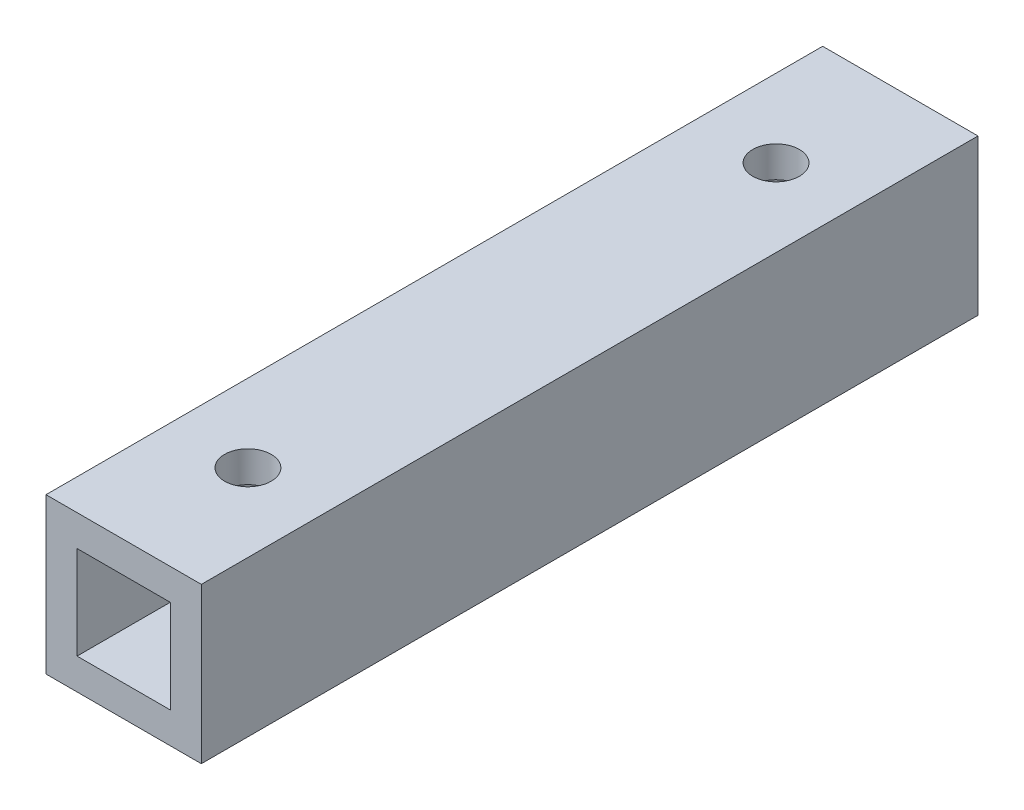
ISO-10303-21;
HEADER;
FILE_DESCRIPTION(('STEP AP214'),'2;1');
FILE_NAME('part.step','',(''),(''),'','','');
FILE_SCHEMA(('AUTOMOTIVE_DESIGN { 1 0 10303 214 1 1 1 1 }'));
ENDSEC;
DATA;
#1=APPLICATION_CONTEXT('core data for automotive mechanical design processes');
#2=APPLICATION_PROTOCOL_DEFINITION('international standard','automotive_design',2000,#1);
#3=PRODUCT_CONTEXT('',#1,'mechanical');
#4=PRODUCT('Part','Part','',(#3));
#5=PRODUCT_RELATED_PRODUCT_CATEGORY('part','',(#4));
#6=PRODUCT_DEFINITION_FORMATION('','',#4);
#7=PRODUCT_DEFINITION_CONTEXT('part definition',#1,'design');
#8=PRODUCT_DEFINITION('design','',#6,#7);
#9=PRODUCT_DEFINITION_SHAPE('','',#8);
#10=(LENGTH_UNIT() NAMED_UNIT(*) SI_UNIT(.MILLI.,.METRE.));
#11=(NAMED_UNIT(*) PLANE_ANGLE_UNIT() SI_UNIT($,.RADIAN.));
#12=(NAMED_UNIT(*) SI_UNIT($,.STERADIAN.) SOLID_ANGLE_UNIT());
#13=UNCERTAINTY_MEASURE_WITH_UNIT(LENGTH_MEASURE(1.E-05),#10,'distance_accuracy_value','');
#14=(GEOMETRIC_REPRESENTATION_CONTEXT(3) GLOBAL_UNCERTAINTY_ASSIGNED_CONTEXT((#13)) GLOBAL_UNIT_ASSIGNED_CONTEXT((#10,
#11,#12)) REPRESENTATION_CONTEXT('',''));
#15=CARTESIAN_POINT('',(0.,0.,0.));
#16=DIRECTION('',(0.,0.,1.));
#17=DIRECTION('',(1.,0.,0.));
#18=AXIS2_PLACEMENT_3D('',#15,#16,#17);
#19=CARTESIAN_POINT('',(0.,-5.,-17.));
#20=DIRECTION('',(0.,1.,0.));
#21=DIRECTION('',(0.,0.,1.));
#22=AXIS2_PLACEMENT_3D('',#19,#20,#21);
#23=CYLINDRICAL_SURFACE('',#22,1.5);
#24=CARTESIAN_POINT('',(0.,-3.,-17.));
#25=DIRECTION('',(0.,-1.,0.));
#26=DIRECTION('',(0.,0.,-1.));
#27=AXIS2_PLACEMENT_3D('',#24,#25,#26);
#28=CIRCLE('',#27,1.5);
#29=CARTESIAN_POINT('',(0.,-3.,-18.5));
#30=VERTEX_POINT('',#29);
#31=EDGE_CURVE('E143',#30,#30,#28,.F.);
#32=ORIENTED_EDGE('',*,*,#31,.T.);
#33=EDGE_LOOP('',(#32));
#34=FACE_BOUND('',#33,.T.);
#35=CARTESIAN_POINT('',(0.,-5.,-17.));
#36=DIRECTION('',(0.,1.,0.));
#37=DIRECTION('',(0.,0.,1.));
#38=AXIS2_PLACEMENT_3D('',#35,#36,#37);
#39=CIRCLE('',#38,1.5);
#40=CARTESIAN_POINT('',(0.,-5.,-15.5));
#41=VERTEX_POINT('',#40);
#42=EDGE_CURVE('E153',#41,#41,#39,.T.);
#43=ORIENTED_EDGE('',*,*,#42,.F.);
#44=EDGE_LOOP('',(#43));
#45=FACE_BOUND('',#44,.T.);
#46=ADVANCED_FACE('F35',(#34,#45),#23,.F.);
#47=CARTESIAN_POINT('',(0.,-5.,17.));
#48=DIRECTION('',(0.,1.,0.));
#49=DIRECTION('',(0.,0.,1.));
#50=AXIS2_PLACEMENT_3D('',#47,#48,#49);
#51=CYLINDRICAL_SURFACE('',#50,1.5);
#52=CARTESIAN_POINT('',(0.,-3.,17.));
#53=DIRECTION('',(0.,-1.,0.));
#54=DIRECTION('',(0.,0.,-1.));
#55=AXIS2_PLACEMENT_3D('',#52,#53,#54);
#56=CIRCLE('',#55,1.5);
#57=CARTESIAN_POINT('',(0.,-3.,15.5));
#58=VERTEX_POINT('',#57);
#59=EDGE_CURVE('E39',#58,#58,#56,.T.);
#60=ORIENTED_EDGE('',*,*,#59,.F.);
#61=EDGE_LOOP('',(#60));
#62=FACE_BOUND('',#61,.T.);
#63=CARTESIAN_POINT('',(0.,-5.,17.));
#64=DIRECTION('',(0.,-1.,0.));
#65=DIRECTION('',(0.,0.,-1.));
#66=AXIS2_PLACEMENT_3D('',#63,#64,#65);
#67=CIRCLE('',#66,1.5);
#68=CARTESIAN_POINT('',(0.,-5.,15.5));
#69=VERTEX_POINT('',#68);
#70=EDGE_CURVE('E147',#69,#69,#67,.T.);
#71=ORIENTED_EDGE('',*,*,#70,.T.);
#72=EDGE_LOOP('',(#71));
#73=FACE_BOUND('',#72,.T.);
#74=ADVANCED_FACE('F193',(#62,#73),#51,.F.);
#75=CARTESIAN_POINT('',(5.,5.,25.));
#76=DIRECTION('',(-1.,0.,0.));
#77=DIRECTION('',(0.,-1.,0.));
#78=AXIS2_PLACEMENT_3D('',#75,#76,#77);
#79=PLANE('',#78);
#80=DIRECTION('',(0.,1.,0.));
#81=VECTOR('',#80,1.);
#82=CARTESIAN_POINT('',(5.,5.,-25.));
#83=LINE('',#82,#81);
#84=CARTESIAN_POINT('',(5.,-5.,-25.));
#85=VERTEX_POINT('',#84);
#86=CARTESIAN_POINT('',(5.,5.,-25.));
#87=VERTEX_POINT('',#86);
#88=EDGE_CURVE('E156',#85,#87,#83,.T.);
#89=ORIENTED_EDGE('',*,*,#88,.T.);
#90=DIRECTION('',(0.,0.,-1.));
#91=VECTOR('',#90,1.);
#92=CARTESIAN_POINT('',(5.,5.,25.));
#93=LINE('',#92,#91);
#94=CARTESIAN_POINT('',(5.,5.,25.));
#95=VERTEX_POINT('',#94);
#96=EDGE_CURVE('E11',#95,#87,#93,.T.);
#97=ORIENTED_EDGE('',*,*,#96,.F.);
#98=DIRECTION('',(0.,1.,0.));
#99=VECTOR('',#98,1.);
#100=CARTESIAN_POINT('',(5.,5.,25.));
#101=LINE('',#100,#99);
#102=CARTESIAN_POINT('',(5.,-5.,25.));
#103=VERTEX_POINT('',#102);
#104=EDGE_CURVE('E159',#103,#95,#101,.T.);
#105=ORIENTED_EDGE('',*,*,#104,.F.);
#106=DIRECTION('',(0.,0.,-1.));
#107=VECTOR('',#106,1.);
#108=CARTESIAN_POINT('',(5.,-5.,25.));
#109=LINE('',#108,#107);
#110=EDGE_CURVE('E169',#103,#85,#109,.T.);
#111=ORIENTED_EDGE('',*,*,#110,.T.);
#112=EDGE_LOOP('',(#89,#97,#105,#111));
#113=FACE_BOUND('',#112,.T.);
#114=ADVANCED_FACE('F37',(#113),#79,.F.);
#115=CARTESIAN_POINT('',(-5.,5.,25.));
#116=DIRECTION('',(0.,-1.,0.));
#117=DIRECTION('',(0.,0.,-1.));
#118=AXIS2_PLACEMENT_3D('',#115,#116,#117);
#119=PLANE('',#118);
#120=CARTESIAN_POINT('',(0.,5.,17.));
#121=DIRECTION('',(0.,-1.,0.));
#122=DIRECTION('',(0.,0.,-1.));
#123=AXIS2_PLACEMENT_3D('',#120,#121,#122);
#124=CIRCLE('',#123,1.5);
#125=CARTESIAN_POINT('',(0.,5.,15.5));
#126=VERTEX_POINT('',#125);
#127=EDGE_CURVE('E146',#126,#126,#124,.T.);
#128=ORIENTED_EDGE('',*,*,#127,.T.);
#129=EDGE_LOOP('',(#128));
#130=FACE_BOUND('',#129,.T.);
#131=CARTESIAN_POINT('',(0.,5.,-17.));
#132=DIRECTION('',(0.,1.,0.));
#133=DIRECTION('',(0.,0.,1.));
#134=AXIS2_PLACEMENT_3D('',#131,#132,#133);
#135=CIRCLE('',#134,1.5);
#136=CARTESIAN_POINT('',(0.,5.,-15.5));
#137=VERTEX_POINT('',#136);
#138=EDGE_CURVE('E150',#137,#137,#135,.T.);
#139=ORIENTED_EDGE('',*,*,#138,.F.);
#140=EDGE_LOOP('',(#139));
#141=FACE_BOUND('',#140,.T.);
#142=DIRECTION('',(-1.,0.,0.));
#143=VECTOR('',#142,1.);
#144=CARTESIAN_POINT('',(-5.,5.,-25.));
#145=LINE('',#144,#143);
#146=CARTESIAN_POINT('',(-5.,5.,-25.));
#147=VERTEX_POINT('',#146);
#148=EDGE_CURVE('E172',#87,#147,#145,.T.);
#149=ORIENTED_EDGE('',*,*,#148,.T.);
#150=DIRECTION('',(0.,0.,-1.));
#151=VECTOR('',#150,1.);
#152=CARTESIAN_POINT('',(-5.,5.,25.));
#153=LINE('',#152,#151);
#154=CARTESIAN_POINT('',(-5.,5.,25.));
#155=VERTEX_POINT('',#154);
#156=EDGE_CURVE('E44',#155,#147,#153,.T.);
#157=ORIENTED_EDGE('',*,*,#156,.F.);
#158=DIRECTION('',(-1.,0.,0.));
#159=VECTOR('',#158,1.);
#160=CARTESIAN_POINT('',(-5.,5.,25.));
#161=LINE('',#160,#159);
#162=EDGE_CURVE('E162',#95,#155,#161,.T.);
#163=ORIENTED_EDGE('',*,*,#162,.F.);
#164=ORIENTED_EDGE('',*,*,#96,.T.);
#165=EDGE_LOOP('',(#149,#157,#163,#164));
#166=FACE_BOUND('',#165,.T.);
#167=ADVANCED_FACE('F196',(#130,#141,#166),#119,.F.);
#168=CARTESIAN_POINT('',(-5.,5.,25.));
#169=DIRECTION('',(1.,0.,0.));
#170=DIRECTION('',(0.,1.,0.));
#171=AXIS2_PLACEMENT_3D('',#168,#169,#170);
#172=PLANE('',#171);
#173=DIRECTION('',(0.,-1.,0.));
#174=VECTOR('',#173,1.);
#175=CARTESIAN_POINT('',(-5.,5.,-25.));
#176=LINE('',#175,#174);
#177=CARTESIAN_POINT('',(-5.,-5.,-25.));
#178=VERTEX_POINT('',#177);
#179=EDGE_CURVE('E174',#147,#178,#176,.T.);
#180=ORIENTED_EDGE('',*,*,#179,.T.);
#181=DIRECTION('',(0.,0.,-1.));
#182=VECTOR('',#181,1.);
#183=CARTESIAN_POINT('',(-5.,-5.,25.));
#184=LINE('',#183,#182);
#185=CARTESIAN_POINT('',(-5.,-5.,25.));
#186=VERTEX_POINT('',#185);
#187=EDGE_CURVE('E179',#186,#178,#184,.T.);
#188=ORIENTED_EDGE('',*,*,#187,.F.);
#189=DIRECTION('',(0.,-1.,0.));
#190=VECTOR('',#189,1.);
#191=CARTESIAN_POINT('',(-5.,5.,25.));
#192=LINE('',#191,#190);
#193=EDGE_CURVE('E165',#155,#186,#192,.T.);
#194=ORIENTED_EDGE('',*,*,#193,.F.);
#195=ORIENTED_EDGE('',*,*,#156,.T.);
#196=EDGE_LOOP('',(#180,#188,#194,#195));
#197=FACE_BOUND('',#196,.T.);
#198=ADVANCED_FACE('F199',(#197),#172,.F.);
#199=CARTESIAN_POINT('',(-5.,-5.,25.));
#200=DIRECTION('',(0.,1.,0.));
#201=DIRECTION('',(0.,0.,1.));
#202=AXIS2_PLACEMENT_3D('',#199,#200,#201);
#203=PLANE('',#202);
#204=ORIENTED_EDGE('',*,*,#70,.F.);
#205=EDGE_LOOP('',(#204));
#206=FACE_BOUND('',#205,.T.);
#207=ORIENTED_EDGE('',*,*,#42,.T.);
#208=EDGE_LOOP('',(#207));
#209=FACE_BOUND('',#208,.T.);
#210=DIRECTION('',(1.,0.,0.));
#211=VECTOR('',#210,1.);
#212=CARTESIAN_POINT('',(-5.,-5.,-25.));
#213=LINE('',#212,#211);
#214=EDGE_CURVE('E163',#178,#85,#213,.T.);
#215=ORIENTED_EDGE('',*,*,#214,.T.);
#216=ORIENTED_EDGE('',*,*,#110,.F.);
#217=DIRECTION('',(1.,0.,0.));
#218=VECTOR('',#217,1.);
#219=CARTESIAN_POINT('',(-5.,-5.,25.));
#220=LINE('',#219,#218);
#221=EDGE_CURVE('E167',#186,#103,#220,.T.);
#222=ORIENTED_EDGE('',*,*,#221,.F.);
#223=ORIENTED_EDGE('',*,*,#187,.T.);
#224=EDGE_LOOP('',(#215,#216,#222,#223));
#225=FACE_BOUND('',#224,.T.);
#226=ADVANCED_FACE('F212',(#206,#209,#225),#203,.F.);
#227=CARTESIAN_POINT('',(0.,0.,25.));
#228=DIRECTION('',(0.,0.,1.));
#229=DIRECTION('',(1.,0.,0.));
#230=AXIS2_PLACEMENT_3D('',#227,#228,#229);
#231=PLANE('',#230);
#232=DIRECTION('',(0.,1.,0.));
#233=VECTOR('',#232,1.);
#234=CARTESIAN_POINT('',(3.,3.,25.));
#235=LINE('',#234,#233);
#236=CARTESIAN_POINT('',(3.,-3.,25.));
#237=VERTEX_POINT('',#236);
#238=CARTESIAN_POINT('',(3.,3.,25.));
#239=VERTEX_POINT('',#238);
#240=EDGE_CURVE('E52',#237,#239,#235,.T.);
#241=ORIENTED_EDGE('',*,*,#240,.F.);
#242=DIRECTION('',(1.,0.,0.));
#243=VECTOR('',#242,1.);
#244=CARTESIAN_POINT('',(-3.,-3.,25.));
#245=LINE('',#244,#243);
#246=CARTESIAN_POINT('',(-3.,-3.,25.));
#247=VERTEX_POINT('',#246);
#248=EDGE_CURVE('E121',#247,#237,#245,.T.);
#249=ORIENTED_EDGE('',*,*,#248,.F.);
#250=DIRECTION('',(0.,-1.,0.));
#251=VECTOR('',#250,1.);
#252=CARTESIAN_POINT('',(-3.,3.,25.));
#253=LINE('',#252,#251);
#254=CARTESIAN_POINT('',(-3.,3.,25.));
#255=VERTEX_POINT('',#254);
#256=EDGE_CURVE('E124',#255,#247,#253,.T.);
#257=ORIENTED_EDGE('',*,*,#256,.F.);
#258=DIRECTION('',(-1.,0.,0.));
#259=VECTOR('',#258,1.);
#260=CARTESIAN_POINT('',(-3.,3.,25.));
#261=LINE('',#260,#259);
#262=EDGE_CURVE('E130',#239,#255,#261,.T.);
#263=ORIENTED_EDGE('',*,*,#262,.F.);
#264=EDGE_LOOP('',(#241,#249,#257,#263));
#265=FACE_BOUND('',#264,.T.);
#266=ORIENTED_EDGE('',*,*,#104,.T.);
#267=ORIENTED_EDGE('',*,*,#162,.T.);
#268=ORIENTED_EDGE('',*,*,#193,.T.);
#269=ORIENTED_EDGE('',*,*,#221,.T.);
#270=EDGE_LOOP('',(#266,#267,#268,#269));
#271=FACE_BOUND('',#270,.T.);
#272=ADVANCED_FACE('F217',(#265,#271),#231,.T.);
#273=CARTESIAN_POINT('',(0.,0.,-25.));
#274=DIRECTION('',(0.,0.,1.));
#275=DIRECTION('',(1.,0.,0.));
#276=AXIS2_PLACEMENT_3D('',#273,#274,#275);
#277=PLANE('',#276);
#278=DIRECTION('',(1.,0.,0.));
#279=VECTOR('',#278,1.);
#280=CARTESIAN_POINT('',(-3.,-3.,-25.));
#281=LINE('',#280,#279);
#282=CARTESIAN_POINT('',(-3.,-3.,-25.));
#283=VERTEX_POINT('',#282);
#284=CARTESIAN_POINT('',(3.,-3.,-25.));
#285=VERTEX_POINT('',#284);
#286=EDGE_CURVE('E110',#283,#285,#281,.T.);
#287=ORIENTED_EDGE('',*,*,#286,.T.);
#288=DIRECTION('',(0.,1.,0.));
#289=VECTOR('',#288,1.);
#290=CARTESIAN_POINT('',(3.,3.,-25.));
#291=LINE('',#290,#289);
#292=CARTESIAN_POINT('',(3.,3.,-25.));
#293=VERTEX_POINT('',#292);
#294=EDGE_CURVE('E104',#285,#293,#291,.T.);
#295=ORIENTED_EDGE('',*,*,#294,.T.);
#296=DIRECTION('',(-1.,0.,0.));
#297=VECTOR('',#296,1.);
#298=CARTESIAN_POINT('',(-3.,3.,-25.));
#299=LINE('',#298,#297);
#300=CARTESIAN_POINT('',(-3.,3.,-25.));
#301=VERTEX_POINT('',#300);
#302=EDGE_CURVE('E113',#293,#301,#299,.T.);
#303=ORIENTED_EDGE('',*,*,#302,.T.);
#304=DIRECTION('',(0.,-1.,0.));
#305=VECTOR('',#304,1.);
#306=CARTESIAN_POINT('',(-3.,3.,-25.));
#307=LINE('',#306,#305);
#308=EDGE_CURVE('E60',#301,#283,#307,.T.);
#309=ORIENTED_EDGE('',*,*,#308,.T.);
#310=EDGE_LOOP('',(#287,#295,#303,#309));
#311=FACE_BOUND('',#310,.T.);
#312=ORIENTED_EDGE('',*,*,#88,.F.);
#313=ORIENTED_EDGE('',*,*,#214,.F.);
#314=ORIENTED_EDGE('',*,*,#179,.F.);
#315=ORIENTED_EDGE('',*,*,#148,.F.);
#316=EDGE_LOOP('',(#312,#313,#314,#315));
#317=FACE_BOUND('',#316,.T.);
#318=ADVANCED_FACE('F118',(#311,#317),#277,.F.);
#319=CARTESIAN_POINT('',(0.,3.,-17.));
#320=DIRECTION('',(0.,1.,0.));
#321=DIRECTION('',(0.,0.,1.));
#322=AXIS2_PLACEMENT_3D('',#319,#320,#321);
#323=CIRCLE('',#322,1.5);
#324=CARTESIAN_POINT('',(0.,3.,-15.5));
#325=VERTEX_POINT('',#324);
#326=EDGE_CURVE('E140',#325,#325,#323,.F.);
#327=ORIENTED_EDGE('',*,*,#326,.T.);
#328=EDGE_LOOP('',(#327));
#329=FACE_BOUND('',#328,.T.);
#330=ORIENTED_EDGE('',*,*,#138,.T.);
#331=EDGE_LOOP('',(#330));
#332=FACE_BOUND('',#331,.T.);
#333=ADVANCED_FACE('F191',(#329,#332),#23,.F.);
#334=CARTESIAN_POINT('',(0.,3.,17.));
#335=DIRECTION('',(0.,1.,0.));
#336=DIRECTION('',(0.,0.,1.));
#337=AXIS2_PLACEMENT_3D('',#334,#335,#336);
#338=CIRCLE('',#337,1.5);
#339=CARTESIAN_POINT('',(0.,3.,18.5));
#340=VERTEX_POINT('',#339);
#341=EDGE_CURVE('E136',#340,#340,#338,.T.);
#342=ORIENTED_EDGE('',*,*,#341,.F.);
#343=EDGE_LOOP('',(#342));
#344=FACE_BOUND('',#343,.T.);
#345=ORIENTED_EDGE('',*,*,#127,.F.);
#346=EDGE_LOOP('',(#345));
#347=FACE_BOUND('',#346,.T.);
#348=ADVANCED_FACE('F187',(#344,#347),#51,.F.);
#349=CARTESIAN_POINT('',(-3.,-3.,-25.));
#350=DIRECTION('',(0.,-1.,0.));
#351=DIRECTION('',(0.,0.,-1.));
#352=AXIS2_PLACEMENT_3D('',#349,#350,#351);
#353=PLANE('',#352);
#354=ORIENTED_EDGE('',*,*,#248,.T.);
#355=DIRECTION('',(0.,0.,1.));
#356=VECTOR('',#355,1.);
#357=CARTESIAN_POINT('',(3.,-3.,-25.));
#358=LINE('',#357,#356);
#359=EDGE_CURVE('E134',#285,#237,#358,.T.);
#360=ORIENTED_EDGE('',*,*,#359,.F.);
#361=ORIENTED_EDGE('',*,*,#286,.F.);
#362=DIRECTION('',(0.,0.,1.));
#363=VECTOR('',#362,1.);
#364=CARTESIAN_POINT('',(-3.,-3.,-25.));
#365=LINE('',#364,#363);
#366=EDGE_CURVE('E137',#283,#247,#365,.T.);
#367=ORIENTED_EDGE('',*,*,#366,.T.);
#368=EDGE_LOOP('',(#354,#360,#361,#367));
#369=FACE_BOUND('',#368,.T.);
#370=ORIENTED_EDGE('',*,*,#59,.T.);
#371=EDGE_LOOP('',(#370));
#372=FACE_BOUND('',#371,.T.);
#373=ORIENTED_EDGE('',*,*,#31,.F.);
#374=EDGE_LOOP('',(#373));
#375=FACE_BOUND('',#374,.T.);
#376=ADVANCED_FACE('F190',(#369,#372,#375),#353,.F.);
#377=CARTESIAN_POINT('',(-3.,3.,-25.));
#378=DIRECTION('',(0.,1.,0.));
#379=DIRECTION('',(0.,0.,1.));
#380=AXIS2_PLACEMENT_3D('',#377,#378,#379);
#381=PLANE('',#380);
#382=ORIENTED_EDGE('',*,*,#262,.T.);
#383=DIRECTION('',(0.,0.,1.));
#384=VECTOR('',#383,1.);
#385=CARTESIAN_POINT('',(-3.,3.,-25.));
#386=LINE('',#385,#384);
#387=EDGE_CURVE('E109',#301,#255,#386,.T.);
#388=ORIENTED_EDGE('',*,*,#387,.F.);
#389=ORIENTED_EDGE('',*,*,#302,.F.);
#390=DIRECTION('',(0.,0.,1.));
#391=VECTOR('',#390,1.);
#392=CARTESIAN_POINT('',(3.,3.,-25.));
#393=LINE('',#392,#391);
#394=EDGE_CURVE('E100',#293,#239,#393,.T.);
#395=ORIENTED_EDGE('',*,*,#394,.T.);
#396=EDGE_LOOP('',(#382,#388,#389,#395));
#397=FACE_BOUND('',#396,.T.);
#398=ORIENTED_EDGE('',*,*,#341,.T.);
#399=EDGE_LOOP('',(#398));
#400=FACE_BOUND('',#399,.T.);
#401=ORIENTED_EDGE('',*,*,#326,.F.);
#402=EDGE_LOOP('',(#401));
#403=FACE_BOUND('',#402,.T.);
#404=ADVANCED_FACE('F114',(#397,#400,#403),#381,.F.);
#405=CARTESIAN_POINT('',(3.,3.,-25.));
#406=DIRECTION('',(1.,0.,0.));
#407=DIRECTION('',(0.,1.,0.));
#408=AXIS2_PLACEMENT_3D('',#405,#406,#407);
#409=PLANE('',#408);
#410=ORIENTED_EDGE('',*,*,#240,.T.);
#411=ORIENTED_EDGE('',*,*,#394,.F.);
#412=ORIENTED_EDGE('',*,*,#294,.F.);
#413=ORIENTED_EDGE('',*,*,#359,.T.);
#414=EDGE_LOOP('',(#410,#411,#412,#413));
#415=FACE_BOUND('',#414,.T.);
#416=ADVANCED_FACE('F102',(#415),#409,.F.);
#417=CARTESIAN_POINT('',(-3.,3.,-25.));
#418=DIRECTION('',(-1.,0.,0.));
#419=DIRECTION('',(0.,-1.,0.));
#420=AXIS2_PLACEMENT_3D('',#417,#418,#419);
#421=PLANE('',#420);
#422=ORIENTED_EDGE('',*,*,#256,.T.);
#423=ORIENTED_EDGE('',*,*,#366,.F.);
#424=ORIENTED_EDGE('',*,*,#308,.F.);
#425=ORIENTED_EDGE('',*,*,#387,.T.);
#426=EDGE_LOOP('',(#422,#423,#424,#425));
#427=FACE_BOUND('',#426,.T.);
#428=ADVANCED_FACE('F248',(#427),#421,.F.);
#429=CLOSED_SHELL('',(#46,#74,#114,#167,#198,#226,#272,#318,#333,#348,#376,#404,#416,#428));
#430=MANIFOLD_SOLID_BREP('B2',#429);
#431=ADVANCED_BREP_SHAPE_REPRESENTATION('',(#18,#430),#14);
#432=SHAPE_DEFINITION_REPRESENTATION(#9,#431);
ENDSEC;
END-ISO-10303-21;
